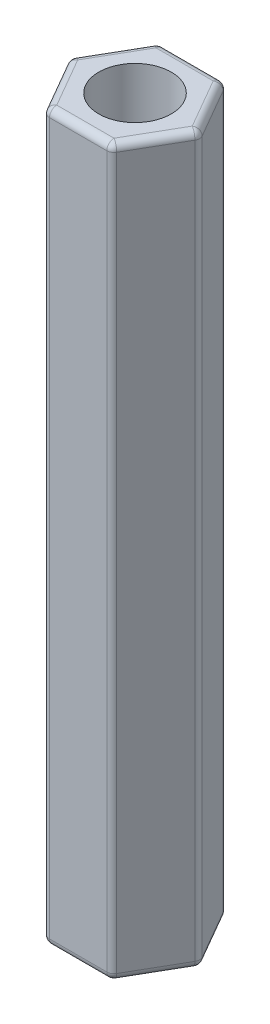
ISO-10303-21;
HEADER;
FILE_DESCRIPTION(('STEP AP214'),'2;1');
FILE_NAME('part.step','',(''),(''),'','','');
FILE_SCHEMA(('AUTOMOTIVE_DESIGN { 1 0 10303 214 1 1 1 1 }'));
ENDSEC;
DATA;
#1=APPLICATION_CONTEXT('core data for automotive mechanical design processes');
#2=APPLICATION_PROTOCOL_DEFINITION('international standard','automotive_design',2000,#1);
#3=PRODUCT_CONTEXT('',#1,'mechanical');
#4=PRODUCT('Part','Part','',(#3));
#5=PRODUCT_RELATED_PRODUCT_CATEGORY('part','',(#4));
#6=PRODUCT_DEFINITION_FORMATION('','',#4);
#7=PRODUCT_DEFINITION_CONTEXT('part definition',#1,'design');
#8=PRODUCT_DEFINITION('design','',#6,#7);
#9=PRODUCT_DEFINITION_SHAPE('','',#8);
#10=(LENGTH_UNIT() NAMED_UNIT(*) SI_UNIT(.MILLI.,.METRE.));
#11=(NAMED_UNIT(*) PLANE_ANGLE_UNIT() SI_UNIT($,.RADIAN.));
#12=(NAMED_UNIT(*) SI_UNIT($,.STERADIAN.) SOLID_ANGLE_UNIT());
#13=UNCERTAINTY_MEASURE_WITH_UNIT(LENGTH_MEASURE(1.E-05),#10,'distance_accuracy_value','');
#14=(GEOMETRIC_REPRESENTATION_CONTEXT(3) GLOBAL_UNCERTAINTY_ASSIGNED_CONTEXT((#13)) GLOBAL_UNIT_ASSIGNED_CONTEXT((#10,
#11,#12)) REPRESENTATION_CONTEXT('',''));
#15=CARTESIAN_POINT('',(0.,0.,0.));
#16=DIRECTION('',(0.,0.,1.));
#17=DIRECTION('',(1.,0.,0.));
#18=AXIS2_PLACEMENT_3D('',#15,#16,#17);
#19=CARTESIAN_POINT('',(0.,30.,0.));
#20=DIRECTION('',(0.,1.,0.));
#21=DIRECTION('',(0.,0.,1.));
#22=AXIS2_PLACEMENT_3D('',#19,#20,#21);
#23=PLANE('',#22);
#24=DIRECTION('',(0.500000000000007,0.,0.866025403784435));
#25=VECTOR('',#24,1.);
#26=CARTESIAN_POINT('',(-1.09696551146027,30.,2.20000000000001));
#27=LINE('',#26,#25);
#28=CARTESIAN_POINT('',(-2.36713610367747,30.,0.));
#29=VERTEX_POINT('',#28);
#30=CARTESIAN_POINT('',(-1.18356805183872,30.,2.05000000000001));
#31=VERTEX_POINT('',#30);
#32=EDGE_CURVE('E254',#29,#31,#27,.T.);
#33=ORIENTED_EDGE('',*,*,#32,.T.);
#34=DIRECTION('',(1.,0.,0.));
#35=VECTOR('',#34,1.);
#36=CARTESIAN_POINT('',(1.35677313259565,30.,2.04999999999999));
#37=LINE('',#36,#35);
#38=CARTESIAN_POINT('',(1.18356805183876,30.,2.04999999999999));
#39=VERTEX_POINT('',#38);
#40=EDGE_CURVE('E256',#31,#39,#37,.T.);
#41=ORIENTED_EDGE('',*,*,#40,.T.);
#42=DIRECTION('',(0.499999999999995,0.,-0.866025403784442));
#43=VECTOR('',#42,1.);
#44=CARTESIAN_POINT('',(2.45373864405591,30.,-0.149999999999999));
#45=LINE('',#44,#43);
#46=CARTESIAN_POINT('',(2.36713610367747,30.,0.));
#47=VERTEX_POINT('',#46);
#48=EDGE_CURVE('E246',#39,#47,#45,.T.);
#49=ORIENTED_EDGE('',*,*,#48,.T.);
#50=DIRECTION('',(-0.500000000000001,0.,-0.866025403784438));
#51=VECTOR('',#50,1.);
#52=CARTESIAN_POINT('',(1.09696551146028,30.,-2.20000000000001));
#53=LINE('',#52,#51);
#54=CARTESIAN_POINT('',(1.18356805183873,30.,-2.05000000000001));
#55=VERTEX_POINT('',#54);
#56=EDGE_CURVE('E248',#47,#55,#53,.T.);
#57=ORIENTED_EDGE('',*,*,#56,.T.);
#58=DIRECTION('',(-1.,0.,0.));
#59=VECTOR('',#58,1.);
#60=CARTESIAN_POINT('',(-1.35677313259563,30.,-2.05));
#61=LINE('',#60,#59);
#62=CARTESIAN_POINT('',(-1.18356805183874,30.,-2.05));
#63=VERTEX_POINT('',#62);
#64=EDGE_CURVE('E250',#55,#63,#61,.T.);
#65=ORIENTED_EDGE('',*,*,#64,.T.);
#66=DIRECTION('',(-0.499999999999995,0.,0.866025403784442));
#67=VECTOR('',#66,1.);
#68=CARTESIAN_POINT('',(-2.45373864405591,30.,0.150000000000018));
#69=LINE('',#68,#67);
#70=EDGE_CURVE('E252',#63,#29,#69,.T.);
#71=ORIENTED_EDGE('',*,*,#70,.T.);
#72=EDGE_LOOP('',(#33,#41,#49,#57,#65,#71));
#73=FACE_BOUND('',#72,.T.);
#74=CARTESIAN_POINT('',(0.,30.,0.));
#75=DIRECTION('',(0.,1.,0.));
#76=DIRECTION('',(0.,0.,1.));
#77=AXIS2_PLACEMENT_3D('',#74,#75,#76);
#78=CIRCLE('',#77,1.5);
#79=CARTESIAN_POINT('',(0.,30.,1.5));
#80=VERTEX_POINT('',#79);
#81=EDGE_CURVE('E193',#80,#80,#78,.T.);
#82=ORIENTED_EDGE('',*,*,#81,.F.);
#83=EDGE_LOOP('',(#82));
#84=FACE_BOUND('',#83,.T.);
#85=ADVANCED_FACE('F36',(#73,#84),#23,.T.);
#86=CARTESIAN_POINT('',(0.,0.,0.));
#87=DIRECTION('',(0.,1.,0.));
#88=DIRECTION('',(0.,0.,1.));
#89=AXIS2_PLACEMENT_3D('',#86,#87,#88);
#90=PLANE('',#89);
#91=DIRECTION('',(0.499999999999995,0.,-0.866025403784442));
#92=VECTOR('',#91,1.);
#93=CARTESIAN_POINT('',(1.77535207775811,0.,1.02499999999999));
#94=LINE('',#93,#92);
#95=CARTESIAN_POINT('',(2.36713610367747,0.,0.));
#96=VERTEX_POINT('',#95);
#97=CARTESIAN_POINT('',(1.18356805183876,0.,2.04999999999999));
#98=VERTEX_POINT('',#97);
#99=EDGE_CURVE('E259',#96,#98,#94,.F.);
#100=ORIENTED_EDGE('',*,*,#99,.T.);
#101=DIRECTION('',(1.,0.,0.));
#102=VECTOR('',#101,1.);
#103=CARTESIAN_POINT('',(0.,0.,2.05));
#104=LINE('',#103,#102);
#105=CARTESIAN_POINT('',(-1.18356805183872,0.,2.05000000000001));
#106=VERTEX_POINT('',#105);
#107=EDGE_CURVE('E11',#98,#106,#104,.F.);
#108=ORIENTED_EDGE('',*,*,#107,.T.);
#109=DIRECTION('',(0.500000000000007,0.,0.866025403784435));
#110=VECTOR('',#109,1.);
#111=CARTESIAN_POINT('',(-1.77535207775809,0.,1.02500000000001));
#112=LINE('',#111,#110);
#113=CARTESIAN_POINT('',(-2.36713610367747,0.,0.));
#114=VERTEX_POINT('',#113);
#115=EDGE_CURVE('E45',#106,#114,#112,.F.);
#116=ORIENTED_EDGE('',*,*,#115,.T.);
#117=DIRECTION('',(-0.499999999999995,0.,0.866025403784442));
#118=VECTOR('',#117,1.);
#119=CARTESIAN_POINT('',(-1.77535207775811,0.,-1.02499999999999));
#120=LINE('',#119,#118);
#121=CARTESIAN_POINT('',(-1.18356805183874,0.,-2.05));
#122=VERTEX_POINT('',#121);
#123=EDGE_CURVE('E265',#114,#122,#120,.F.);
#124=ORIENTED_EDGE('',*,*,#123,.T.);
#125=DIRECTION('',(-1.,0.,0.));
#126=VECTOR('',#125,1.);
#127=CARTESIAN_POINT('',(0.,0.,-2.05));
#128=LINE('',#127,#126);
#129=CARTESIAN_POINT('',(1.18356805183873,0.,-2.05000000000001));
#130=VERTEX_POINT('',#129);
#131=EDGE_CURVE('E263',#122,#130,#128,.F.);
#132=ORIENTED_EDGE('',*,*,#131,.T.);
#133=DIRECTION('',(-0.500000000000001,0.,-0.866025403784438));
#134=VECTOR('',#133,1.);
#135=CARTESIAN_POINT('',(1.7753520777581,0.,-1.025));
#136=LINE('',#135,#134);
#137=EDGE_CURVE('E261',#130,#96,#136,.F.);
#138=ORIENTED_EDGE('',*,*,#137,.T.);
#139=EDGE_LOOP('',(#100,#108,#116,#124,#132,#138));
#140=FACE_BOUND('',#139,.T.);
#141=CARTESIAN_POINT('',(0.,0.,0.));
#142=DIRECTION('',(0.,1.,0.));
#143=DIRECTION('',(0.,0.,1.));
#144=AXIS2_PLACEMENT_3D('',#141,#142,#143);
#145=CIRCLE('',#144,1.5);
#146=CARTESIAN_POINT('',(0.,0.,1.5));
#147=VERTEX_POINT('',#146);
#148=EDGE_CURVE('E357',#147,#147,#145,.T.);
#149=ORIENTED_EDGE('',*,*,#148,.T.);
#150=EDGE_LOOP('',(#149));
#151=FACE_BOUND('',#150,.T.);
#152=ADVANCED_FACE('F374',(#140,#151),#90,.F.);
#153=CARTESIAN_POINT('',(1.35677313259565,30.,2.34999999999999));
#154=DIRECTION('',(-0.866025403784441,0.,-0.499999999999995));
#155=DIRECTION('',(-0.499999999999995,0.,0.866025403784442));
#156=AXIS2_PLACEMENT_3D('',#153,#154,#155);
#157=PLANE('',#156);
#158=DIRECTION('',(0.,-1.,0.));
#159=VECTOR('',#158,1.);
#160=CARTESIAN_POINT('',(2.6269437248128,30.,0.15));
#161=LINE('',#160,#159);
#162=CARTESIAN_POINT('',(2.6269437248128,0.300000000000002,0.15));
#163=VERTEX_POINT('',#162);
#164=CARTESIAN_POINT('',(2.6269437248128,29.7,0.15));
#165=VERTEX_POINT('',#164);
#166=EDGE_CURVE('E170',#163,#165,#161,.F.);
#167=ORIENTED_EDGE('',*,*,#166,.T.);
#168=DIRECTION('',(0.499999999999995,0.,-0.866025403784442));
#169=VECTOR('',#168,1.);
#170=CARTESIAN_POINT('',(1.35677313259565,29.7,2.34999999999999));
#171=LINE('',#170,#169);
#172=CARTESIAN_POINT('',(1.44337567297409,29.7,2.19999999999999));
#173=VERTEX_POINT('',#172);
#174=EDGE_CURVE('E208',#165,#173,#171,.F.);
#175=ORIENTED_EDGE('',*,*,#174,.T.);
#176=DIRECTION('',(0.,-1.,0.));
#177=VECTOR('',#176,1.);
#178=CARTESIAN_POINT('',(1.44337567297409,30.,2.19999999999999));
#179=LINE('',#178,#177);
#180=CARTESIAN_POINT('',(1.44337567297409,0.300000000000002,2.19999999999999));
#181=VERTEX_POINT('',#180);
#182=EDGE_CURVE('E205',#173,#181,#179,.T.);
#183=ORIENTED_EDGE('',*,*,#182,.T.);
#184=DIRECTION('',(0.499999999999995,0.,-0.866025403784442));
#185=VECTOR('',#184,1.);
#186=CARTESIAN_POINT('',(1.35677313259565,0.300000000000002,2.34999999999999));
#187=LINE('',#186,#185);
#188=EDGE_CURVE('E200',#181,#163,#187,.T.);
#189=ORIENTED_EDGE('',*,*,#188,.T.);
#190=EDGE_LOOP('',(#167,#175,#183,#189));
#191=FACE_BOUND('',#190,.T.);
#192=ADVANCED_FACE('F380',(#191),#157,.F.);
#193=CARTESIAN_POINT('',(2.71354626519124,30.,0.));
#194=DIRECTION('',(-0.866025403784438,0.,0.500000000000001));
#195=DIRECTION('',(0.500000000000001,0.,0.866025403784438));
#196=AXIS2_PLACEMENT_3D('',#193,#194,#195);
#197=PLANE('',#196);
#198=DIRECTION('',(0.,-1.,0.));
#199=VECTOR('',#198,1.);
#200=CARTESIAN_POINT('',(1.44337567297406,30.,-2.20000000000001));
#201=LINE('',#200,#199);
#202=CARTESIAN_POINT('',(1.44337567297406,0.300000000000002,-2.20000000000001));
#203=VERTEX_POINT('',#202);
#204=CARTESIAN_POINT('',(1.44337567297406,29.7,-2.20000000000001));
#205=VERTEX_POINT('',#204);
#206=EDGE_CURVE('E192',#203,#205,#201,.F.);
#207=ORIENTED_EDGE('',*,*,#206,.T.);
#208=DIRECTION('',(-0.500000000000001,0.,-0.866025403784438));
#209=VECTOR('',#208,1.);
#210=CARTESIAN_POINT('',(2.71354626519124,29.7,0.));
#211=LINE('',#210,#209);
#212=CARTESIAN_POINT('',(2.6269437248128,29.7,-0.149999999999999));
#213=VERTEX_POINT('',#212);
#214=EDGE_CURVE('E197',#205,#213,#211,.F.);
#215=ORIENTED_EDGE('',*,*,#214,.T.);
#216=DIRECTION('',(0.,-1.,0.));
#217=VECTOR('',#216,1.);
#218=CARTESIAN_POINT('',(2.6269437248128,30.,-0.149999999999999));
#219=LINE('',#218,#217);
#220=CARTESIAN_POINT('',(2.6269437248128,0.300000000000002,-0.149999999999999));
#221=VERTEX_POINT('',#220);
#222=EDGE_CURVE('E168',#213,#221,#219,.T.);
#223=ORIENTED_EDGE('',*,*,#222,.T.);
#224=DIRECTION('',(-0.500000000000001,0.,-0.866025403784438));
#225=VECTOR('',#224,1.);
#226=CARTESIAN_POINT('',(2.71354626519124,0.300000000000002,0.));
#227=LINE('',#226,#225);
#228=EDGE_CURVE('E186',#221,#203,#227,.T.);
#229=ORIENTED_EDGE('',*,*,#228,.T.);
#230=EDGE_LOOP('',(#207,#215,#223,#229));
#231=FACE_BOUND('',#230,.T.);
#232=ADVANCED_FACE('F195',(#231),#197,.F.);
#233=CARTESIAN_POINT('',(1.35677313259562,30.,-2.35000000000001));
#234=DIRECTION('',(0.,0.,1.));
#235=DIRECTION('',(1.,0.,0.));
#236=AXIS2_PLACEMENT_3D('',#233,#234,#235);
#237=PLANE('',#236);
#238=DIRECTION('',(0.,-1.,0.));
#239=VECTOR('',#238,1.);
#240=CARTESIAN_POINT('',(-1.18356805183874,30.,-2.35));
#241=LINE('',#240,#239);
#242=CARTESIAN_POINT('',(-1.18356805183874,0.300000000000002,-2.35));
#243=VERTEX_POINT('',#242);
#244=CARTESIAN_POINT('',(-1.18356805183874,29.7,-2.35));
#245=VERTEX_POINT('',#244);
#246=EDGE_CURVE('E212',#243,#245,#241,.F.);
#247=ORIENTED_EDGE('',*,*,#246,.T.);
#248=DIRECTION('',(-1.,0.,0.));
#249=VECTOR('',#248,1.);
#250=CARTESIAN_POINT('',(1.35677313259562,29.7,-2.35000000000001));
#251=LINE('',#250,#249);
#252=CARTESIAN_POINT('',(1.18356805183873,29.7,-2.35));
#253=VERTEX_POINT('',#252);
#254=EDGE_CURVE('E217',#245,#253,#251,.F.);
#255=ORIENTED_EDGE('',*,*,#254,.T.);
#256=DIRECTION('',(0.,-1.,0.));
#257=VECTOR('',#256,1.);
#258=CARTESIAN_POINT('',(1.18356805183873,30.,-2.35));
#259=LINE('',#258,#257);
#260=CARTESIAN_POINT('',(1.18356805183873,0.300000000000002,-2.35));
#261=VERTEX_POINT('',#260);
#262=EDGE_CURVE('E214',#253,#261,#259,.T.);
#263=ORIENTED_EDGE('',*,*,#262,.T.);
#264=DIRECTION('',(-1.,0.,0.));
#265=VECTOR('',#264,1.);
#266=CARTESIAN_POINT('',(1.35677313259562,0.300000000000002,-2.35000000000001));
#267=LINE('',#266,#265);
#268=EDGE_CURVE('E210',#261,#243,#267,.T.);
#269=ORIENTED_EDGE('',*,*,#268,.T.);
#270=EDGE_LOOP('',(#247,#255,#263,#269));
#271=FACE_BOUND('',#270,.T.);
#272=ADVANCED_FACE('F395',(#271),#237,.F.);
#273=CARTESIAN_POINT('',(-1.35677313259563,30.,-2.35));
#274=DIRECTION('',(0.866025403784441,0.,0.499999999999995));
#275=DIRECTION('',(0.499999999999995,0.,-0.866025403784442));
#276=AXIS2_PLACEMENT_3D('',#273,#274,#275);
#277=PLANE('',#276);
#278=DIRECTION('',(0.,-1.,0.));
#279=VECTOR('',#278,1.);
#280=CARTESIAN_POINT('',(-2.6269437248128,30.,-0.149999999999982));
#281=LINE('',#280,#279);
#282=CARTESIAN_POINT('',(-2.6269437248128,0.300000000000002,-0.149999999999982));
#283=VERTEX_POINT('',#282);
#284=CARTESIAN_POINT('',(-2.6269437248128,29.7,-0.149999999999982));
#285=VERTEX_POINT('',#284);
#286=EDGE_CURVE('E221',#283,#285,#281,.F.);
#287=ORIENTED_EDGE('',*,*,#286,.T.);
#288=DIRECTION('',(-0.499999999999995,0.,0.866025403784442));
#289=VECTOR('',#288,1.);
#290=CARTESIAN_POINT('',(-1.35677313259563,29.7,-2.35));
#291=LINE('',#290,#289);
#292=CARTESIAN_POINT('',(-1.44337567297408,29.7,-2.19999999999999));
#293=VERTEX_POINT('',#292);
#294=EDGE_CURVE('E226',#285,#293,#291,.F.);
#295=ORIENTED_EDGE('',*,*,#294,.T.);
#296=DIRECTION('',(0.,-1.,0.));
#297=VECTOR('',#296,1.);
#298=CARTESIAN_POINT('',(-1.44337567297408,30.,-2.19999999999999));
#299=LINE('',#298,#297);
#300=CARTESIAN_POINT('',(-1.44337567297408,0.300000000000002,-2.19999999999999));
#301=VERTEX_POINT('',#300);
#302=EDGE_CURVE('E223',#293,#301,#299,.T.);
#303=ORIENTED_EDGE('',*,*,#302,.T.);
#304=DIRECTION('',(-0.499999999999995,0.,0.866025403784442));
#305=VECTOR('',#304,1.);
#306=CARTESIAN_POINT('',(-1.35677313259563,0.300000000000002,-2.35));
#307=LINE('',#306,#305);
#308=EDGE_CURVE('E219',#301,#283,#307,.T.);
#309=ORIENTED_EDGE('',*,*,#308,.T.);
#310=EDGE_LOOP('',(#287,#295,#303,#309));
#311=FACE_BOUND('',#310,.T.);
#312=ADVANCED_FACE('F391',(#311),#277,.F.);
#313=CARTESIAN_POINT('',(-2.71354626519124,30.,0.));
#314=DIRECTION('',(0.866025403784434,0.,-0.500000000000007));
#315=DIRECTION('',(-0.500000000000007,0.,-0.866025403784435));
#316=AXIS2_PLACEMENT_3D('',#313,#314,#315);
#317=PLANE('',#316);
#318=DIRECTION('',(0.,-1.,0.));
#319=VECTOR('',#318,1.);
#320=CARTESIAN_POINT('',(-1.44337567297405,30.,2.20000000000001));
#321=LINE('',#320,#319);
#322=CARTESIAN_POINT('',(-1.44337567297405,0.300000000000002,2.20000000000001));
#323=VERTEX_POINT('',#322);
#324=CARTESIAN_POINT('',(-1.44337567297405,29.7,2.20000000000001));
#325=VERTEX_POINT('',#324);
#326=EDGE_CURVE('E230',#323,#325,#321,.F.);
#327=ORIENTED_EDGE('',*,*,#326,.T.);
#328=DIRECTION('',(0.500000000000007,0.,0.866025403784435));
#329=VECTOR('',#328,1.);
#330=CARTESIAN_POINT('',(-2.71354626519124,29.7,0.));
#331=LINE('',#330,#329);
#332=CARTESIAN_POINT('',(-2.6269437248128,29.7,0.150000000000019));
#333=VERTEX_POINT('',#332);
#334=EDGE_CURVE('E235',#325,#333,#331,.F.);
#335=ORIENTED_EDGE('',*,*,#334,.T.);
#336=DIRECTION('',(0.,-1.,0.));
#337=VECTOR('',#336,1.);
#338=CARTESIAN_POINT('',(-2.6269437248128,30.,0.150000000000019));
#339=LINE('',#338,#337);
#340=CARTESIAN_POINT('',(-2.6269437248128,0.300000000000002,0.150000000000019));
#341=VERTEX_POINT('',#340);
#342=EDGE_CURVE('E232',#333,#341,#339,.T.);
#343=ORIENTED_EDGE('',*,*,#342,.T.);
#344=DIRECTION('',(0.500000000000007,0.,0.866025403784435));
#345=VECTOR('',#344,1.);
#346=CARTESIAN_POINT('',(-2.71354626519124,0.300000000000002,0.));
#347=LINE('',#346,#345);
#348=EDGE_CURVE('E228',#341,#323,#347,.T.);
#349=ORIENTED_EDGE('',*,*,#348,.T.);
#350=EDGE_LOOP('',(#327,#335,#343,#349));
#351=FACE_BOUND('',#350,.T.);
#352=ADVANCED_FACE('F387',(#351),#317,.F.);
#353=CARTESIAN_POINT('',(-1.3567731325956,30.,2.35000000000001));
#354=DIRECTION('',(0.,0.,-1.));
#355=DIRECTION('',(-1.,0.,0.));
#356=AXIS2_PLACEMENT_3D('',#353,#354,#355);
#357=PLANE('',#356);
#358=DIRECTION('',(0.,-1.,0.));
#359=VECTOR('',#358,1.);
#360=CARTESIAN_POINT('',(1.18356805183876,30.,2.34999999999999));
#361=LINE('',#360,#359);
#362=CARTESIAN_POINT('',(1.18356805183876,0.300000000000002,2.34999999999999));
#363=VERTEX_POINT('',#362);
#364=CARTESIAN_POINT('',(1.18356805183876,29.7,2.34999999999999));
#365=VERTEX_POINT('',#364);
#366=EDGE_CURVE('E239',#363,#365,#361,.F.);
#367=ORIENTED_EDGE('',*,*,#366,.T.);
#368=DIRECTION('',(1.,0.,0.));
#369=VECTOR('',#368,1.);
#370=CARTESIAN_POINT('',(-1.3567731325956,29.7,2.35000000000001));
#371=LINE('',#370,#369);
#372=CARTESIAN_POINT('',(-1.18356805183871,29.7,2.35000000000001));
#373=VERTEX_POINT('',#372);
#374=EDGE_CURVE('E244',#365,#373,#371,.F.);
#375=ORIENTED_EDGE('',*,*,#374,.T.);
#376=DIRECTION('',(0.,-1.,0.));
#377=VECTOR('',#376,1.);
#378=CARTESIAN_POINT('',(-1.18356805183871,30.,2.35000000000001));
#379=LINE('',#378,#377);
#380=CARTESIAN_POINT('',(-1.18356805183871,0.300000000000002,2.35000000000001));
#381=VERTEX_POINT('',#380);
#382=EDGE_CURVE('E241',#373,#381,#379,.T.);
#383=ORIENTED_EDGE('',*,*,#382,.T.);
#384=DIRECTION('',(1.,0.,0.));
#385=VECTOR('',#384,1.);
#386=CARTESIAN_POINT('',(-1.3567731325956,0.300000000000002,2.35000000000001));
#387=LINE('',#386,#385);
#388=EDGE_CURVE('E237',#381,#363,#387,.T.);
#389=ORIENTED_EDGE('',*,*,#388,.T.);
#390=EDGE_LOOP('',(#367,#375,#383,#389));
#391=FACE_BOUND('',#390,.T.);
#392=ADVANCED_FACE('F384',(#391),#357,.F.);
#393=CARTESIAN_POINT('',(0.,30.,0.));
#394=DIRECTION('',(0.,-1.,0.));
#395=DIRECTION('',(0.,0.,-1.));
#396=AXIS2_PLACEMENT_3D('',#393,#394,#395);
#397=CYLINDRICAL_SURFACE('',#396,1.5);
#398=ORIENTED_EDGE('',*,*,#81,.T.);
#399=EDGE_LOOP('',(#398));
#400=FACE_BOUND('',#399,.T.);
#401=ORIENTED_EDGE('',*,*,#148,.F.);
#402=EDGE_LOOP('',(#401));
#403=FACE_BOUND('',#402,.T.);
#404=ADVANCED_FACE('F370',(#400,#403),#397,.F.);
#405=CARTESIAN_POINT('',(-2.36713610367747,30.,0.));
#406=DIRECTION('',(0.,-1.,0.));
#407=DIRECTION('',(0.,0.,-1.));
#408=AXIS2_PLACEMENT_3D('',#405,#406,#407);
#409=CYLINDRICAL_SURFACE('',#408,0.3);
#410=CARTESIAN_POINT('',(-2.36713610367747,29.7,0.));
#411=DIRECTION('',(0.,1.,0.));
#412=DIRECTION('',(0.,0.,1.));
#413=AXIS2_PLACEMENT_3D('',#410,#411,#412);
#414=CIRCLE('',#413,0.3);
#415=EDGE_CURVE('E40',#285,#333,#414,.T.);
#416=ORIENTED_EDGE('',*,*,#415,.F.);
#417=ORIENTED_EDGE('',*,*,#286,.F.);
#418=CARTESIAN_POINT('',(-2.36713610367747,0.300000000000002,0.));
#419=DIRECTION('',(0.,-1.,0.));
#420=DIRECTION('',(0.,0.,-1.));
#421=AXIS2_PLACEMENT_3D('',#418,#419,#420);
#422=CIRCLE('',#421,0.3);
#423=EDGE_CURVE('E350',#341,#283,#422,.T.);
#424=ORIENTED_EDGE('',*,*,#423,.F.);
#425=ORIENTED_EDGE('',*,*,#342,.F.);
#426=EDGE_LOOP('',(#416,#417,#424,#425));
#427=FACE_BOUND('',#426,.T.);
#428=ADVANCED_FACE('F38',(#427),#409,.T.);
#429=CARTESIAN_POINT('',(-2.36713610367747,29.7,0.));
#430=DIRECTION('',(0.,0.,1.));
#431=DIRECTION('',(1.,0.,0.));
#432=AXIS2_PLACEMENT_3D('',#429,#430,#431);
#433=SPHERICAL_SURFACE('',#432,0.3);
#434=CARTESIAN_POINT('',(-2.36713610367747,29.7,0.));
#435=DIRECTION('',(-0.499999999999997,0.,0.866025403784441));
#436=DIRECTION('',(0.866025403784441,0.,0.499999999999997));
#437=AXIS2_PLACEMENT_3D('',#434,#435,#436);
#438=CIRCLE('',#437,0.3);
#439=EDGE_CURVE('E345',#285,#29,#438,.F.);
#440=ORIENTED_EDGE('',*,*,#439,.F.);
#441=ORIENTED_EDGE('',*,*,#415,.T.);
#442=CARTESIAN_POINT('',(-2.36713610367747,29.7,0.));
#443=DIRECTION('',(-0.500000000000007,0.,-0.866025403784435));
#444=DIRECTION('',(-0.866025403784435,0.,0.500000000000007));
#445=AXIS2_PLACEMENT_3D('',#442,#443,#444);
#446=CIRCLE('',#445,0.3);
#447=EDGE_CURVE('E348',#29,#333,#446,.F.);
#448=ORIENTED_EDGE('',*,*,#447,.F.);
#449=EDGE_LOOP('',(#440,#441,#448));
#450=FACE_BOUND('',#449,.T.);
#451=ADVANCED_FACE('F508',(#450),#433,.T.);
#452=CARTESIAN_POINT('',(-2.36713610367747,0.3,0.));
#453=DIRECTION('',(0.,0.,1.));
#454=DIRECTION('',(1.,0.,0.));
#455=AXIS2_PLACEMENT_3D('',#452,#453,#454);
#456=SPHERICAL_SURFACE('',#455,0.3);
#457=CARTESIAN_POINT('',(-2.36713610367747,0.3,0.));
#458=DIRECTION('',(-0.500000000000007,0.,-0.866025403784435));
#459=DIRECTION('',(-0.866025403784435,0.,0.500000000000007));
#460=AXIS2_PLACEMENT_3D('',#457,#458,#459);
#461=CIRCLE('',#460,0.3);
#462=EDGE_CURVE('E340',#341,#114,#461,.F.);
#463=ORIENTED_EDGE('',*,*,#462,.F.);
#464=ORIENTED_EDGE('',*,*,#423,.T.);
#465=CARTESIAN_POINT('',(-2.36713610367747,0.300000000000002,0.));
#466=DIRECTION('',(-0.499999999999995,0.,0.866025403784442));
#467=DIRECTION('',(0.866025403784442,0.,0.499999999999995));
#468=AXIS2_PLACEMENT_3D('',#465,#466,#467);
#469=CIRCLE('',#468,0.3);
#470=EDGE_CURVE('E342',#114,#283,#469,.F.);
#471=ORIENTED_EDGE('',*,*,#470,.F.);
#472=EDGE_LOOP('',(#463,#464,#471));
#473=FACE_BOUND('',#472,.T.);
#474=ADVANCED_FACE('F505',(#473),#456,.T.);
#475=CARTESIAN_POINT('',(-1.77535207775809,29.7,1.02500000000001));
#476=DIRECTION('',(-0.500000000000007,0.,-0.866025403784435));
#477=DIRECTION('',(-0.866025403784434,0.,0.500000000000007));
#478=AXIS2_PLACEMENT_3D('',#475,#476,#477);
#479=CYLINDRICAL_SURFACE('',#478,0.3);
#480=ORIENTED_EDGE('',*,*,#447,.T.);
#481=ORIENTED_EDGE('',*,*,#334,.F.);
#482=CARTESIAN_POINT('',(-1.18356805183872,29.7,2.05000000000001));
#483=DIRECTION('',(0.500000000000008,0.,0.866025403784434));
#484=DIRECTION('',(0.866025403784434,0.,-0.500000000000008));
#485=AXIS2_PLACEMENT_3D('',#482,#483,#484);
#486=CIRCLE('',#485,0.3);
#487=EDGE_CURVE('E334',#31,#325,#486,.T.);
#488=ORIENTED_EDGE('',*,*,#487,.F.);
#489=ORIENTED_EDGE('',*,*,#32,.F.);
#490=EDGE_LOOP('',(#480,#481,#488,#489));
#491=FACE_BOUND('',#490,.T.);
#492=ADVANCED_FACE('F501',(#491),#479,.T.);
#493=CARTESIAN_POINT('',(-1.77535207775811,29.7,-1.02499999999999));
#494=DIRECTION('',(0.499999999999995,0.,-0.866025403784442));
#495=DIRECTION('',(-0.866025403784441,0.,-0.499999999999995));
#496=AXIS2_PLACEMENT_3D('',#493,#494,#495);
#497=CYLINDRICAL_SURFACE('',#496,0.3);
#498=ORIENTED_EDGE('',*,*,#439,.T.);
#499=ORIENTED_EDGE('',*,*,#70,.F.);
#500=CARTESIAN_POINT('',(-1.18356805183874,29.7,-2.05));
#501=DIRECTION('',(0.499999999999996,0.,-0.866025403784441));
#502=DIRECTION('',(-0.866025403784441,0.,-0.499999999999996));
#503=AXIS2_PLACEMENT_3D('',#500,#501,#502);
#504=CIRCLE('',#503,0.3);
#505=EDGE_CURVE('E331',#293,#63,#504,.T.);
#506=ORIENTED_EDGE('',*,*,#505,.F.);
#507=ORIENTED_EDGE('',*,*,#294,.F.);
#508=EDGE_LOOP('',(#498,#499,#506,#507));
#509=FACE_BOUND('',#508,.T.);
#510=ADVANCED_FACE('F497',(#509),#497,.T.);
#511=CARTESIAN_POINT('',(-1.18356805183874,30.,-2.05));
#512=DIRECTION('',(0.,-1.,0.));
#513=DIRECTION('',(0.,0.,-1.));
#514=AXIS2_PLACEMENT_3D('',#511,#512,#513);
#515=CYLINDRICAL_SURFACE('',#514,0.3);
#516=CARTESIAN_POINT('',(-1.18356805183874,0.300000000000002,-2.05));
#517=DIRECTION('',(0.,-1.,0.));
#518=DIRECTION('',(0.,0.,-1.));
#519=AXIS2_PLACEMENT_3D('',#516,#517,#518);
#520=CIRCLE('',#519,0.3);
#521=EDGE_CURVE('E325',#301,#243,#520,.T.);
#522=ORIENTED_EDGE('',*,*,#521,.F.);
#523=ORIENTED_EDGE('',*,*,#302,.F.);
#524=CARTESIAN_POINT('',(-1.18356805183874,29.7,-2.05));
#525=DIRECTION('',(0.,1.,0.));
#526=DIRECTION('',(0.,0.,1.));
#527=AXIS2_PLACEMENT_3D('',#524,#525,#526);
#528=CIRCLE('',#527,0.3);
#529=EDGE_CURVE('E328',#245,#293,#528,.T.);
#530=ORIENTED_EDGE('',*,*,#529,.F.);
#531=ORIENTED_EDGE('',*,*,#246,.F.);
#532=EDGE_LOOP('',(#522,#523,#530,#531));
#533=FACE_BOUND('',#532,.T.);
#534=ADVANCED_FACE('F493',(#533),#515,.T.);
#535=CARTESIAN_POINT('',(-1.0969655114603,0.300000000000002,-2.2));
#536=DIRECTION('',(-0.499999999999995,0.,0.866025403784442));
#537=DIRECTION('',(0.866025403784441,0.,0.499999999999995));
#538=AXIS2_PLACEMENT_3D('',#535,#536,#537);
#539=CYLINDRICAL_SURFACE('',#538,0.3);
#540=ORIENTED_EDGE('',*,*,#470,.T.);
#541=ORIENTED_EDGE('',*,*,#308,.F.);
#542=CARTESIAN_POINT('',(-1.18356805183874,0.3,-2.05));
#543=DIRECTION('',(0.499999999999995,0.,-0.866025403784441));
#544=DIRECTION('',(-0.866025403784441,0.,-0.499999999999995));
#545=AXIS2_PLACEMENT_3D('',#542,#543,#544);
#546=CIRCLE('',#545,0.3);
#547=EDGE_CURVE('E323',#122,#301,#546,.T.);
#548=ORIENTED_EDGE('',*,*,#547,.F.);
#549=ORIENTED_EDGE('',*,*,#123,.F.);
#550=EDGE_LOOP('',(#540,#541,#548,#549));
#551=FACE_BOUND('',#550,.T.);
#552=ADVANCED_FACE('F489',(#551),#539,.T.);
#553=CARTESIAN_POINT('',(-2.45373864405591,0.300000000000002,-0.149999999999983));
#554=DIRECTION('',(0.500000000000007,0.,0.866025403784435));
#555=DIRECTION('',(0.866025403784434,0.,-0.500000000000007));
#556=AXIS2_PLACEMENT_3D('',#553,#554,#555);
#557=CYLINDRICAL_SURFACE('',#556,0.3);
#558=ORIENTED_EDGE('',*,*,#462,.T.);
#559=ORIENTED_EDGE('',*,*,#115,.F.);
#560=CARTESIAN_POINT('',(-1.18356805183871,0.300000000000002,2.05000000000001));
#561=DIRECTION('',(0.500000000000007,0.,0.866025403784435));
#562=DIRECTION('',(0.866025403784435,0.,-0.500000000000007));
#563=AXIS2_PLACEMENT_3D('',#560,#561,#562);
#564=CIRCLE('',#563,0.3);
#565=EDGE_CURVE('E321',#323,#106,#564,.T.);
#566=ORIENTED_EDGE('',*,*,#565,.F.);
#567=ORIENTED_EDGE('',*,*,#348,.F.);
#568=EDGE_LOOP('',(#558,#559,#566,#567));
#569=FACE_BOUND('',#568,.T.);
#570=ADVANCED_FACE('F485',(#569),#557,.T.);
#571=CARTESIAN_POINT('',(-1.18356805183872,30.,2.05000000000001));
#572=DIRECTION('',(0.,-1.,0.));
#573=DIRECTION('',(0.,0.,-1.));
#574=AXIS2_PLACEMENT_3D('',#571,#572,#573);
#575=CYLINDRICAL_SURFACE('',#574,0.3);
#576=CARTESIAN_POINT('',(-1.18356805183871,29.7,2.05000000000001));
#577=DIRECTION('',(0.,1.,0.));
#578=DIRECTION('',(0.,0.,1.));
#579=AXIS2_PLACEMENT_3D('',#576,#577,#578);
#580=CIRCLE('',#579,0.3);
#581=EDGE_CURVE('E337',#325,#373,#580,.T.);
#582=ORIENTED_EDGE('',*,*,#581,.F.);
#583=ORIENTED_EDGE('',*,*,#326,.F.);
#584=CARTESIAN_POINT('',(-1.18356805183872,0.300000000000002,2.05000000000001));
#585=DIRECTION('',(0.,-1.,0.));
#586=DIRECTION('',(0.,0.,-1.));
#587=AXIS2_PLACEMENT_3D('',#584,#585,#586);
#588=CIRCLE('',#587,0.3);
#589=EDGE_CURVE('E318',#381,#323,#588,.T.);
#590=ORIENTED_EDGE('',*,*,#589,.F.);
#591=ORIENTED_EDGE('',*,*,#382,.F.);
#592=EDGE_LOOP('',(#582,#583,#590,#591));
#593=FACE_BOUND('',#592,.T.);
#594=ADVANCED_FACE('F481',(#593),#575,.T.);
#595=CARTESIAN_POINT('',(-1.18356805183872,29.7,2.05000000000001));
#596=DIRECTION('',(0.,0.,1.));
#597=DIRECTION('',(1.,0.,0.));
#598=AXIS2_PLACEMENT_3D('',#595,#596,#597);
#599=SPHERICAL_SURFACE('',#598,0.3);
#600=ORIENTED_EDGE('',*,*,#487,.T.);
#601=ORIENTED_EDGE('',*,*,#581,.T.);
#602=CARTESIAN_POINT('',(-1.18356805183872,29.7,2.05000000000001));
#603=DIRECTION('',(-1.,0.,0.));
#604=DIRECTION('',(0.,0.,1.));
#605=AXIS2_PLACEMENT_3D('',#602,#603,#604);
#606=CIRCLE('',#605,0.3);
#607=EDGE_CURVE('E315',#31,#373,#606,.F.);
#608=ORIENTED_EDGE('',*,*,#607,.F.);
#609=EDGE_LOOP('',(#600,#601,#608));
#610=FACE_BOUND('',#609,.T.);
#611=ADVANCED_FACE('F477',(#610),#599,.T.);
#612=CARTESIAN_POINT('',(-1.18356805183874,29.7,-2.05));
#613=DIRECTION('',(0.,0.,1.));
#614=DIRECTION('',(1.,0.,0.));
#615=AXIS2_PLACEMENT_3D('',#612,#613,#614);
#616=SPHERICAL_SURFACE('',#615,0.3);
#617=ORIENTED_EDGE('',*,*,#529,.T.);
#618=ORIENTED_EDGE('',*,*,#505,.T.);
#619=CARTESIAN_POINT('',(-1.18356805183874,29.7,-2.05));
#620=DIRECTION('',(-1.,0.,0.));
#621=DIRECTION('',(0.,0.,1.));
#622=AXIS2_PLACEMENT_3D('',#619,#620,#621);
#623=CIRCLE('',#622,0.3);
#624=EDGE_CURVE('E312',#245,#63,#623,.F.);
#625=ORIENTED_EDGE('',*,*,#624,.F.);
#626=EDGE_LOOP('',(#617,#618,#625));
#627=FACE_BOUND('',#626,.T.);
#628=ADVANCED_FACE('F473',(#627),#616,.T.);
#629=CARTESIAN_POINT('',(-1.18356805183874,0.3,-2.05));
#630=DIRECTION('',(0.,0.,1.));
#631=DIRECTION('',(1.,0.,0.));
#632=AXIS2_PLACEMENT_3D('',#629,#630,#631);
#633=SPHERICAL_SURFACE('',#632,0.3);
#634=ORIENTED_EDGE('',*,*,#547,.T.);
#635=ORIENTED_EDGE('',*,*,#521,.T.);
#636=CARTESIAN_POINT('',(-1.18356805183874,0.300000000000002,-2.05));
#637=DIRECTION('',(-1.,0.,0.));
#638=DIRECTION('',(0.,0.,1.));
#639=AXIS2_PLACEMENT_3D('',#636,#637,#638);
#640=CIRCLE('',#639,0.3);
#641=EDGE_CURVE('E309',#122,#243,#640,.F.);
#642=ORIENTED_EDGE('',*,*,#641,.F.);
#643=EDGE_LOOP('',(#634,#635,#642));
#644=FACE_BOUND('',#643,.T.);
#645=ADVANCED_FACE('F469',(#644),#633,.T.);
#646=CARTESIAN_POINT('',(-1.18356805183872,0.3,2.05000000000001));
#647=DIRECTION('',(0.,0.,1.));
#648=DIRECTION('',(1.,0.,0.));
#649=AXIS2_PLACEMENT_3D('',#646,#647,#648);
#650=SPHERICAL_SURFACE('',#649,0.3);
#651=ORIENTED_EDGE('',*,*,#589,.T.);
#652=ORIENTED_EDGE('',*,*,#565,.T.);
#653=CARTESIAN_POINT('',(-1.18356805183872,0.3,2.05000000000001));
#654=DIRECTION('',(-1.,0.,0.));
#655=DIRECTION('',(0.,0.,1.));
#656=AXIS2_PLACEMENT_3D('',#653,#654,#655);
#657=CIRCLE('',#656,0.3);
#658=EDGE_CURVE('E53',#381,#106,#657,.F.);
#659=ORIENTED_EDGE('',*,*,#658,.F.);
#660=EDGE_LOOP('',(#651,#652,#659));
#661=FACE_BOUND('',#660,.T.);
#662=ADVANCED_FACE('F465',(#661),#650,.T.);
#663=CARTESIAN_POINT('',(0.,29.7,2.05));
#664=DIRECTION('',(-1.,0.,0.));
#665=DIRECTION('',(0.,0.,1.));
#666=AXIS2_PLACEMENT_3D('',#663,#664,#665);
#667=CYLINDRICAL_SURFACE('',#666,0.3);
#668=ORIENTED_EDGE('',*,*,#607,.T.);
#669=ORIENTED_EDGE('',*,*,#374,.F.);
#670=CARTESIAN_POINT('',(1.18356805183876,29.7,2.04999999999999));
#671=DIRECTION('',(1.,0.,0.));
#672=DIRECTION('',(0.,0.,-1.));
#673=AXIS2_PLACEMENT_3D('',#670,#671,#672);
#674=CIRCLE('',#673,0.3);
#675=EDGE_CURVE('E302',#39,#365,#674,.T.);
#676=ORIENTED_EDGE('',*,*,#675,.F.);
#677=ORIENTED_EDGE('',*,*,#40,.F.);
#678=EDGE_LOOP('',(#668,#669,#676,#677));
#679=FACE_BOUND('',#678,.T.);
#680=ADVANCED_FACE('F461',(#679),#667,.T.);
#681=CARTESIAN_POINT('',(0.,29.7,-2.05));
#682=DIRECTION('',(1.,0.,0.));
#683=DIRECTION('',(0.,0.,-1.));
#684=AXIS2_PLACEMENT_3D('',#681,#682,#683);
#685=CYLINDRICAL_SURFACE('',#684,0.3);
#686=ORIENTED_EDGE('',*,*,#624,.T.);
#687=ORIENTED_EDGE('',*,*,#64,.F.);
#688=CARTESIAN_POINT('',(1.18356805183873,29.7,-2.05000000000001));
#689=DIRECTION('',(1.,0.,0.));
#690=DIRECTION('',(0.,0.,-1.));
#691=AXIS2_PLACEMENT_3D('',#688,#689,#690);
#692=CIRCLE('',#691,0.3);
#693=EDGE_CURVE('E299',#253,#55,#692,.T.);
#694=ORIENTED_EDGE('',*,*,#693,.F.);
#695=ORIENTED_EDGE('',*,*,#254,.F.);
#696=EDGE_LOOP('',(#686,#687,#694,#695));
#697=FACE_BOUND('',#696,.T.);
#698=ADVANCED_FACE('F457',(#697),#685,.T.);
#699=CARTESIAN_POINT('',(1.18356805183873,30.,-2.05000000000001));
#700=DIRECTION('',(0.,-1.,0.));
#701=DIRECTION('',(0.,0.,-1.));
#702=AXIS2_PLACEMENT_3D('',#699,#700,#701);
#703=CYLINDRICAL_SURFACE('',#702,0.3);
#704=CARTESIAN_POINT('',(1.18356805183873,0.300000000000002,-2.05000000000001));
#705=DIRECTION('',(0.,-1.,0.));
#706=DIRECTION('',(0.,0.,-1.));
#707=AXIS2_PLACEMENT_3D('',#704,#705,#706);
#708=CIRCLE('',#707,0.3);
#709=EDGE_CURVE('E293',#261,#203,#708,.T.);
#710=ORIENTED_EDGE('',*,*,#709,.F.);
#711=ORIENTED_EDGE('',*,*,#262,.F.);
#712=CARTESIAN_POINT('',(1.18356805183873,29.7,-2.05000000000001));
#713=DIRECTION('',(0.,1.,0.));
#714=DIRECTION('',(0.,0.,1.));
#715=AXIS2_PLACEMENT_3D('',#712,#713,#714);
#716=CIRCLE('',#715,0.3);
#717=EDGE_CURVE('E296',#205,#253,#716,.T.);
#718=ORIENTED_EDGE('',*,*,#717,.F.);
#719=ORIENTED_EDGE('',*,*,#206,.F.);
#720=EDGE_LOOP('',(#710,#711,#718,#719));
#721=FACE_BOUND('',#720,.T.);
#722=ADVANCED_FACE('F453',(#721),#703,.T.);
#723=CARTESIAN_POINT('',(1.35677313259562,0.300000000000002,-2.05000000000001));
#724=DIRECTION('',(-1.,0.,0.));
#725=DIRECTION('',(0.,0.,1.));
#726=AXIS2_PLACEMENT_3D('',#723,#724,#725);
#727=CYLINDRICAL_SURFACE('',#726,0.3);
#728=ORIENTED_EDGE('',*,*,#641,.T.);
#729=ORIENTED_EDGE('',*,*,#268,.F.);
#730=CARTESIAN_POINT('',(1.18356805183873,0.3,-2.05000000000001));
#731=DIRECTION('',(1.,0.,0.));
#732=DIRECTION('',(0.,0.,-1.));
#733=AXIS2_PLACEMENT_3D('',#730,#731,#732);
#734=CIRCLE('',#733,0.3);
#735=EDGE_CURVE('E291',#130,#261,#734,.T.);
#736=ORIENTED_EDGE('',*,*,#735,.F.);
#737=ORIENTED_EDGE('',*,*,#131,.F.);
#738=EDGE_LOOP('',(#728,#729,#736,#737));
#739=FACE_BOUND('',#738,.T.);
#740=ADVANCED_FACE('F450',(#739),#727,.T.);
#741=CARTESIAN_POINT('',(-1.3567731325956,0.300000000000002,2.05000000000001));
#742=DIRECTION('',(1.,0.,0.));
#743=DIRECTION('',(0.,0.,-1.));
#744=AXIS2_PLACEMENT_3D('',#741,#742,#743);
#745=CYLINDRICAL_SURFACE('',#744,0.3);
#746=ORIENTED_EDGE('',*,*,#658,.T.);
#747=ORIENTED_EDGE('',*,*,#107,.F.);
#748=CARTESIAN_POINT('',(1.18356805183876,0.300000000000002,2.04999999999999));
#749=DIRECTION('',(1.,0.,0.));
#750=DIRECTION('',(0.,0.,-1.));
#751=AXIS2_PLACEMENT_3D('',#748,#749,#750);
#752=CIRCLE('',#751,0.3);
#753=EDGE_CURVE('E288',#363,#98,#752,.T.);
#754=ORIENTED_EDGE('',*,*,#753,.F.);
#755=ORIENTED_EDGE('',*,*,#388,.F.);
#756=EDGE_LOOP('',(#746,#747,#754,#755));
#757=FACE_BOUND('',#756,.T.);
#758=ADVANCED_FACE('F446',(#757),#745,.T.);
#759=CARTESIAN_POINT('',(1.18356805183876,30.,2.04999999999999));
#760=DIRECTION('',(0.,-1.,0.));
#761=DIRECTION('',(0.,0.,-1.));
#762=AXIS2_PLACEMENT_3D('',#759,#760,#761);
#763=CYLINDRICAL_SURFACE('',#762,0.3);
#764=CARTESIAN_POINT('',(1.18356805183876,29.7,2.04999999999999));
#765=DIRECTION('',(0.,1.,0.));
#766=DIRECTION('',(0.,0.,1.));
#767=AXIS2_PLACEMENT_3D('',#764,#765,#766);
#768=CIRCLE('',#767,0.3);
#769=EDGE_CURVE('E305',#365,#173,#768,.T.);
#770=ORIENTED_EDGE('',*,*,#769,.F.);
#771=ORIENTED_EDGE('',*,*,#366,.F.);
#772=CARTESIAN_POINT('',(1.18356805183876,0.300000000000002,2.04999999999999));
#773=DIRECTION('',(0.,-1.,0.));
#774=DIRECTION('',(0.,0.,-1.));
#775=AXIS2_PLACEMENT_3D('',#772,#773,#774);
#776=CIRCLE('',#775,0.3);
#777=EDGE_CURVE('E285',#181,#363,#776,.T.);
#778=ORIENTED_EDGE('',*,*,#777,.F.);
#779=ORIENTED_EDGE('',*,*,#182,.F.);
#780=EDGE_LOOP('',(#770,#771,#778,#779));
#781=FACE_BOUND('',#780,.T.);
#782=ADVANCED_FACE('F442',(#781),#763,.T.);
#783=CARTESIAN_POINT('',(1.18356805183876,29.7,2.04999999999999));
#784=DIRECTION('',(0.,0.,1.));
#785=DIRECTION('',(1.,0.,0.));
#786=AXIS2_PLACEMENT_3D('',#783,#784,#785);
#787=SPHERICAL_SURFACE('',#786,0.3);
#788=ORIENTED_EDGE('',*,*,#675,.T.);
#789=ORIENTED_EDGE('',*,*,#769,.T.);
#790=CARTESIAN_POINT('',(1.18356805183876,29.7,2.04999999999999));
#791=DIRECTION('',(-0.499999999999996,0.,0.866025403784441));
#792=DIRECTION('',(0.866025403784441,0.,0.499999999999996));
#793=AXIS2_PLACEMENT_3D('',#790,#791,#792);
#794=CIRCLE('',#793,0.3);
#795=EDGE_CURVE('E282',#39,#173,#794,.F.);
#796=ORIENTED_EDGE('',*,*,#795,.F.);
#797=EDGE_LOOP('',(#788,#789,#796));
#798=FACE_BOUND('',#797,.T.);
#799=ADVANCED_FACE('F438',(#798),#787,.T.);
#800=CARTESIAN_POINT('',(1.18356805183873,29.7,-2.05000000000001));
#801=DIRECTION('',(0.,0.,1.));
#802=DIRECTION('',(1.,0.,0.));
#803=AXIS2_PLACEMENT_3D('',#800,#801,#802);
#804=SPHERICAL_SURFACE('',#803,0.3);
#805=ORIENTED_EDGE('',*,*,#717,.T.);
#806=ORIENTED_EDGE('',*,*,#693,.T.);
#807=CARTESIAN_POINT('',(1.18356805183873,29.7,-2.05000000000001));
#808=DIRECTION('',(-0.500000000000001,0.,-0.866025403784438));
#809=DIRECTION('',(-0.866025403784438,0.,0.500000000000001));
#810=AXIS2_PLACEMENT_3D('',#807,#808,#809);
#811=CIRCLE('',#810,0.3);
#812=EDGE_CURVE('E279',#205,#55,#811,.F.);
#813=ORIENTED_EDGE('',*,*,#812,.F.);
#814=EDGE_LOOP('',(#805,#806,#813));
#815=FACE_BOUND('',#814,.T.);
#816=ADVANCED_FACE('F434',(#815),#804,.T.);
#817=CARTESIAN_POINT('',(1.18356805183873,0.3,-2.05000000000001));
#818=DIRECTION('',(0.,0.,1.));
#819=DIRECTION('',(1.,0.,0.));
#820=AXIS2_PLACEMENT_3D('',#817,#818,#819);
#821=SPHERICAL_SURFACE('',#820,0.3);
#822=ORIENTED_EDGE('',*,*,#735,.T.);
#823=ORIENTED_EDGE('',*,*,#709,.T.);
#824=CARTESIAN_POINT('',(1.18356805183873,0.300000000000002,-2.05000000000001));
#825=DIRECTION('',(-0.500000000000001,0.,-0.866025403784438));
#826=DIRECTION('',(-0.866025403784438,0.,0.500000000000001));
#827=AXIS2_PLACEMENT_3D('',#824,#825,#826);
#828=CIRCLE('',#827,0.3);
#829=EDGE_CURVE('E189',#130,#203,#828,.F.);
#830=ORIENTED_EDGE('',*,*,#829,.F.);
#831=EDGE_LOOP('',(#822,#823,#830));
#832=FACE_BOUND('',#831,.T.);
#833=ADVANCED_FACE('F430',(#832),#821,.T.);
#834=CARTESIAN_POINT('',(1.18356805183876,0.3,2.04999999999999));
#835=DIRECTION('',(0.,0.,1.));
#836=DIRECTION('',(1.,0.,0.));
#837=AXIS2_PLACEMENT_3D('',#834,#835,#836);
#838=SPHERICAL_SURFACE('',#837,0.3);
#839=ORIENTED_EDGE('',*,*,#777,.T.);
#840=ORIENTED_EDGE('',*,*,#753,.T.);
#841=CARTESIAN_POINT('',(1.18356805183876,0.3,2.04999999999999));
#842=DIRECTION('',(-0.499999999999996,0.,0.866025403784441));
#843=DIRECTION('',(0.866025403784441,0.,0.499999999999996));
#844=AXIS2_PLACEMENT_3D('',#841,#842,#843);
#845=CIRCLE('',#844,0.3);
#846=EDGE_CURVE('E275',#181,#98,#845,.F.);
#847=ORIENTED_EDGE('',*,*,#846,.F.);
#848=EDGE_LOOP('',(#839,#840,#847));
#849=FACE_BOUND('',#848,.T.);
#850=ADVANCED_FACE('F426',(#849),#838,.T.);
#851=CARTESIAN_POINT('',(1.77535207775811,29.7,1.02499999999999));
#852=DIRECTION('',(-0.499999999999995,0.,0.866025403784442));
#853=DIRECTION('',(0.866025403784441,0.,0.499999999999995));
#854=AXIS2_PLACEMENT_3D('',#851,#852,#853);
#855=CYLINDRICAL_SURFACE('',#854,0.3);
#856=ORIENTED_EDGE('',*,*,#795,.T.);
#857=ORIENTED_EDGE('',*,*,#174,.F.);
#858=CARTESIAN_POINT('',(2.36713610367747,29.7,0.));
#859=DIRECTION('',(0.499999999999995,0.,-0.866025403784442));
#860=DIRECTION('',(-0.866025403784442,0.,-0.499999999999995));
#861=AXIS2_PLACEMENT_3D('',#858,#859,#860);
#862=CIRCLE('',#861,0.3);
#863=EDGE_CURVE('E272',#47,#165,#862,.T.);
#864=ORIENTED_EDGE('',*,*,#863,.F.);
#865=ORIENTED_EDGE('',*,*,#48,.F.);
#866=EDGE_LOOP('',(#856,#857,#864,#865));
#867=FACE_BOUND('',#866,.T.);
#868=ADVANCED_FACE('F422',(#867),#855,.T.);
#869=CARTESIAN_POINT('',(1.7753520777581,29.7,-1.025));
#870=DIRECTION('',(0.500000000000001,0.,0.866025403784438));
#871=DIRECTION('',(0.866025403784438,0.,-0.500000000000001));
#872=AXIS2_PLACEMENT_3D('',#869,#870,#871);
#873=CYLINDRICAL_SURFACE('',#872,0.3);
#874=ORIENTED_EDGE('',*,*,#812,.T.);
#875=ORIENTED_EDGE('',*,*,#56,.F.);
#876=CARTESIAN_POINT('',(2.36713610367747,29.7,0.));
#877=DIRECTION('',(0.500000000000001,0.,0.866025403784438));
#878=DIRECTION('',(0.866025403784438,0.,-0.500000000000001));
#879=AXIS2_PLACEMENT_3D('',#876,#877,#878);
#880=CIRCLE('',#879,0.3);
#881=EDGE_CURVE('E183',#213,#47,#880,.T.);
#882=ORIENTED_EDGE('',*,*,#881,.F.);
#883=ORIENTED_EDGE('',*,*,#214,.F.);
#884=EDGE_LOOP('',(#874,#875,#882,#883));
#885=FACE_BOUND('',#884,.T.);
#886=ADVANCED_FACE('F419',(#885),#873,.T.);
#887=CARTESIAN_POINT('',(2.45373864405591,0.300000000000002,0.15));
#888=DIRECTION('',(-0.500000000000001,0.,-0.866025403784438));
#889=DIRECTION('',(-0.866025403784438,0.,0.500000000000001));
#890=AXIS2_PLACEMENT_3D('',#887,#888,#889);
#891=CYLINDRICAL_SURFACE('',#890,0.3);
#892=ORIENTED_EDGE('',*,*,#829,.T.);
#893=ORIENTED_EDGE('',*,*,#228,.F.);
#894=CARTESIAN_POINT('',(2.36713610367747,0.3,0.));
#895=DIRECTION('',(0.500000000000003,0.,0.866025403784437));
#896=DIRECTION('',(0.866025403784437,0.,-0.500000000000003));
#897=AXIS2_PLACEMENT_3D('',#894,#895,#896);
#898=CIRCLE('',#897,0.3);
#899=EDGE_CURVE('E176',#96,#221,#898,.T.);
#900=ORIENTED_EDGE('',*,*,#899,.F.);
#901=ORIENTED_EDGE('',*,*,#137,.F.);
#902=EDGE_LOOP('',(#892,#893,#900,#901));
#903=FACE_BOUND('',#902,.T.);
#904=ADVANCED_FACE('F187',(#903),#891,.T.);
#905=CARTESIAN_POINT('',(1.09696551146032,0.300000000000002,2.19999999999999));
#906=DIRECTION('',(0.499999999999995,0.,-0.866025403784442));
#907=DIRECTION('',(-0.866025403784441,0.,-0.499999999999995));
#908=AXIS2_PLACEMENT_3D('',#905,#906,#907);
#909=CYLINDRICAL_SURFACE('',#908,0.3);
#910=ORIENTED_EDGE('',*,*,#846,.T.);
#911=ORIENTED_EDGE('',*,*,#99,.F.);
#912=CARTESIAN_POINT('',(2.36713610367747,0.300000000000002,0.));
#913=DIRECTION('',(0.499999999999995,0.,-0.866025403784441));
#914=DIRECTION('',(-0.866025403784441,0.,-0.499999999999995));
#915=AXIS2_PLACEMENT_3D('',#912,#913,#914);
#916=CIRCLE('',#915,0.3);
#917=EDGE_CURVE('E180',#163,#96,#916,.T.);
#918=ORIENTED_EDGE('',*,*,#917,.F.);
#919=ORIENTED_EDGE('',*,*,#188,.F.);
#920=EDGE_LOOP('',(#910,#911,#918,#919));
#921=FACE_BOUND('',#920,.T.);
#922=ADVANCED_FACE('F412',(#921),#909,.T.);
#923=CARTESIAN_POINT('',(2.36713610367747,29.7,0.));
#924=DIRECTION('',(0.,0.,1.));
#925=DIRECTION('',(1.,0.,0.));
#926=AXIS2_PLACEMENT_3D('',#923,#924,#925);
#927=SPHERICAL_SURFACE('',#926,0.3);
#928=ORIENTED_EDGE('',*,*,#881,.T.);
#929=ORIENTED_EDGE('',*,*,#863,.T.);
#930=CARTESIAN_POINT('',(2.36713610367747,29.7,0.));
#931=DIRECTION('',(0.,1.,0.));
#932=DIRECTION('',(0.,0.,1.));
#933=AXIS2_PLACEMENT_3D('',#930,#931,#932);
#934=CIRCLE('',#933,0.3);
#935=EDGE_CURVE('E173',#213,#165,#934,.F.);
#936=ORIENTED_EDGE('',*,*,#935,.F.);
#937=EDGE_LOOP('',(#928,#929,#936));
#938=FACE_BOUND('',#937,.T.);
#939=ADVANCED_FACE('F409',(#938),#927,.T.);
#940=CARTESIAN_POINT('',(2.36713610367747,0.3,0.));
#941=DIRECTION('',(0.,0.,1.));
#942=DIRECTION('',(1.,0.,0.));
#943=AXIS2_PLACEMENT_3D('',#940,#941,#942);
#944=SPHERICAL_SURFACE('',#943,0.3);
#945=ORIENTED_EDGE('',*,*,#917,.T.);
#946=ORIENTED_EDGE('',*,*,#899,.T.);
#947=CARTESIAN_POINT('',(2.36713610367747,0.300000000000002,0.));
#948=DIRECTION('',(0.,-1.,0.));
#949=DIRECTION('',(0.,0.,-1.));
#950=AXIS2_PLACEMENT_3D('',#947,#948,#949);
#951=CIRCLE('',#950,0.3);
#952=EDGE_CURVE('E164',#163,#221,#951,.F.);
#953=ORIENTED_EDGE('',*,*,#952,.F.);
#954=EDGE_LOOP('',(#945,#946,#953));
#955=FACE_BOUND('',#954,.T.);
#956=ADVANCED_FACE('F178',(#955),#944,.T.);
#957=CARTESIAN_POINT('',(2.36713610367747,30.,0.));
#958=DIRECTION('',(0.,-1.,0.));
#959=DIRECTION('',(0.,0.,-1.));
#960=AXIS2_PLACEMENT_3D('',#957,#958,#959);
#961=CYLINDRICAL_SURFACE('',#960,0.3);
#962=ORIENTED_EDGE('',*,*,#935,.T.);
#963=ORIENTED_EDGE('',*,*,#166,.F.);
#964=ORIENTED_EDGE('',*,*,#952,.T.);
#965=ORIENTED_EDGE('',*,*,#222,.F.);
#966=EDGE_LOOP('',(#962,#963,#964,#965));
#967=FACE_BOUND('',#966,.T.);
#968=ADVANCED_FACE('F166',(#967),#961,.T.);
#969=CLOSED_SHELL('',(#85,#152,#192,#232,#272,#312,#352,#392,#404,#428,#451,#474,#492,#510,#534,
#552,#570,#594,#611,#628,#645,#662,#680,#698,#722,#740,#758,#782,#799,#816,#833,#850,#868,#886,
#904,#922,#939,#956,#968));
#970=MANIFOLD_SOLID_BREP('B2',#969);
#971=ADVANCED_BREP_SHAPE_REPRESENTATION('',(#18,#970),#14);
#972=SHAPE_DEFINITION_REPRESENTATION(#9,#971);
ENDSEC;
END-ISO-10303-21;
